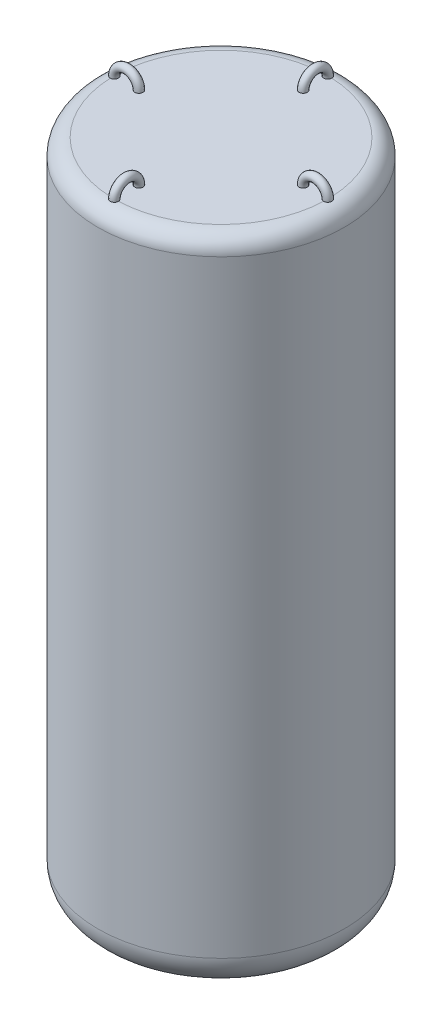
ISO-10303-21;
HEADER;
FILE_DESCRIPTION(('STEP AP214'),'2;1');
FILE_NAME('part.step','',(''),(''),'','','');
FILE_SCHEMA(('AUTOMOTIVE_DESIGN { 1 0 10303 214 1 1 1 1 }'));
ENDSEC;
DATA;
#1=APPLICATION_CONTEXT('core data for automotive mechanical design processes');
#2=APPLICATION_PROTOCOL_DEFINITION('international standard','automotive_design',2000,#1);
#3=PRODUCT_CONTEXT('',#1,'mechanical');
#4=PRODUCT('Part','Part','',(#3));
#5=PRODUCT_RELATED_PRODUCT_CATEGORY('part','',(#4));
#6=PRODUCT_DEFINITION_FORMATION('','',#4);
#7=PRODUCT_DEFINITION_CONTEXT('part definition',#1,'design');
#8=PRODUCT_DEFINITION('design','',#6,#7);
#9=PRODUCT_DEFINITION_SHAPE('','',#8);
#10=(LENGTH_UNIT() NAMED_UNIT(*) SI_UNIT(.MILLI.,.METRE.));
#11=(NAMED_UNIT(*) PLANE_ANGLE_UNIT() SI_UNIT($,.RADIAN.));
#12=(NAMED_UNIT(*) SI_UNIT($,.STERADIAN.) SOLID_ANGLE_UNIT());
#13=UNCERTAINTY_MEASURE_WITH_UNIT(LENGTH_MEASURE(1.E-05),#10,'distance_accuracy_value','');
#14=(GEOMETRIC_REPRESENTATION_CONTEXT(3) GLOBAL_UNCERTAINTY_ASSIGNED_CONTEXT((#13)) GLOBAL_UNIT_ASSIGNED_CONTEXT((#10,
#11,#12)) REPRESENTATION_CONTEXT('',''));
#15=CARTESIAN_POINT('',(0.,0.,0.));
#16=DIRECTION('',(0.,0.,1.));
#17=DIRECTION('',(1.,0.,0.));
#18=AXIS2_PLACEMENT_3D('',#15,#16,#17);
#19=CARTESIAN_POINT('',(0.,0.,0.));
#20=DIRECTION('',(0.,1.,0.));
#21=DIRECTION('',(0.,0.,1.));
#22=AXIS2_PLACEMENT_3D('',#19,#20,#21);
#23=PLANE('',#22);
#24=CARTESIAN_POINT('',(-5.76443569043001E-13,0.,-165.1));
#25=DIRECTION('',(0.,1.,0.));
#26=DIRECTION('',(0.,0.,1.));
#27=AXIS2_PLACEMENT_3D('',#24,#25,#26);
#28=CIRCLE('',#27,6.35);
#29=CARTESIAN_POINT('',(-6.34882570502983,0.,-164.977884615385));
#30=VERTEX_POINT('',#29);
#31=CARTESIAN_POINT('',(6.34882570502868,0.,-164.977884615385));
#32=VERTEX_POINT('',#31);
#33=EDGE_CURVE('E56',#30,#32,#28,.T.);
#34=ORIENTED_EDGE('',*,*,#33,.F.);
#35=CARTESIAN_POINT('',(0.,0.,0.));
#36=DIRECTION('',(0.,1.,0.));
#37=DIRECTION('',(0.,0.,1.));
#38=AXIS2_PLACEMENT_3D('',#35,#36,#37);
#39=CIRCLE('',#38,165.1);
#40=CARTESIAN_POINT('',(-164.977884615385,0.,-6.34882570502925));
#41=VERTEX_POINT('',#40);
#42=EDGE_CURVE('E94',#30,#41,#39,.T.);
#43=ORIENTED_EDGE('',*,*,#42,.T.);
#44=CARTESIAN_POINT('',(-165.1,0.,0.));
#45=DIRECTION('',(0.,1.,0.));
#46=DIRECTION('',(0.,0.,1.));
#47=AXIS2_PLACEMENT_3D('',#44,#45,#46);
#48=CIRCLE('',#47,6.35);
#49=CARTESIAN_POINT('',(-164.977884615385,0.,6.34882570502925));
#50=VERTEX_POINT('',#49);
#51=EDGE_CURVE('E124',#50,#41,#48,.T.);
#52=ORIENTED_EDGE('',*,*,#51,.F.);
#53=CARTESIAN_POINT('',(-6.3488257050277,0.,164.977884615385));
#54=VERTEX_POINT('',#53);
#55=EDGE_CURVE('E140',#50,#54,#39,.T.);
#56=ORIENTED_EDGE('',*,*,#55,.T.);
#57=CARTESIAN_POINT('',(1.72933070712891E-12,0.,165.099999999991));
#58=DIRECTION('',(0.,1.,0.));
#59=DIRECTION('',(0.,0.,1.));
#60=AXIS2_PLACEMENT_3D('',#57,#58,#59);
#61=CIRCLE('',#60,6.35);
#62=CARTESIAN_POINT('',(6.34882570503116,0.,164.977884615385));
#63=VERTEX_POINT('',#62);
#64=EDGE_CURVE('E63',#63,#54,#61,.T.);
#65=ORIENTED_EDGE('',*,*,#64,.F.);
#66=CARTESIAN_POINT('',(164.977884615366,0.,6.34882570502889));
#67=VERTEX_POINT('',#66);
#68=EDGE_CURVE('E99',#63,#67,#39,.T.);
#69=ORIENTED_EDGE('',*,*,#68,.T.);
#70=CARTESIAN_POINT('',(165.1,0.,0.));
#71=DIRECTION('',(0.,1.,0.));
#72=DIRECTION('',(0.,0.,1.));
#73=AXIS2_PLACEMENT_3D('',#70,#71,#72);
#74=CIRCLE('',#73,6.35);
#75=CARTESIAN_POINT('',(164.977884615385,0.,-6.34882570502961));
#76=VERTEX_POINT('',#75);
#77=EDGE_CURVE('E83',#76,#67,#74,.T.);
#78=ORIENTED_EDGE('',*,*,#77,.F.);
#79=EDGE_CURVE('E79',#76,#32,#39,.T.);
#80=ORIENTED_EDGE('',*,*,#79,.T.);
#81=EDGE_LOOP('',(#34,#43,#52,#56,#65,#69,#78,#80));
#82=FACE_BOUND('',#81,.T.);
#83=CARTESIAN_POINT('',(-5.76443569043001E-13,0.,-127.));
#84=DIRECTION('',(0.,1.,0.));
#85=DIRECTION('',(0.,0.,1.));
#86=AXIS2_PLACEMENT_3D('',#83,#84,#85);
#87=CIRCLE('',#86,6.35);
#88=CARTESIAN_POINT('',(-5.76443569043001E-13,0.,-120.65));
#89=VERTEX_POINT('',#88);
#90=EDGE_CURVE('E11',#89,#89,#87,.T.);
#91=ORIENTED_EDGE('',*,*,#90,.F.);
#92=EDGE_LOOP('',(#91));
#93=FACE_BOUND('',#92,.T.);
#94=CARTESIAN_POINT('',(-127.,0.,0.));
#95=DIRECTION('',(0.,-1.,0.));
#96=DIRECTION('',(0.,0.,1.));
#97=AXIS2_PLACEMENT_3D('',#94,#95,#96);
#98=CIRCLE('',#97,6.35);
#99=CARTESIAN_POINT('',(-127.,0.,6.35));
#100=VERTEX_POINT('',#99);
#101=EDGE_CURVE('E119',#100,#100,#98,.T.);
#102=ORIENTED_EDGE('',*,*,#101,.T.);
#103=EDGE_LOOP('',(#102));
#104=FACE_BOUND('',#103,.T.);
#105=CARTESIAN_POINT('',(127.,0.,0.));
#106=DIRECTION('',(0.,1.,0.));
#107=DIRECTION('',(0.,0.,1.));
#108=AXIS2_PLACEMENT_3D('',#105,#106,#107);
#109=CIRCLE('',#108,6.35);
#110=CARTESIAN_POINT('',(127.,0.,6.35));
#111=VERTEX_POINT('',#110);
#112=EDGE_CURVE('E49',#111,#111,#109,.T.);
#113=ORIENTED_EDGE('',*,*,#112,.F.);
#114=EDGE_LOOP('',(#113));
#115=FACE_BOUND('',#114,.T.);
#116=CARTESIAN_POINT('',(1.72933070712891E-12,0.,127.000000000009));
#117=DIRECTION('',(0.,-1.,0.));
#118=DIRECTION('',(0.,0.,-1.));
#119=AXIS2_PLACEMENT_3D('',#116,#117,#118);
#120=CIRCLE('',#119,6.35);
#121=CARTESIAN_POINT('',(1.72933070712891E-12,0.,120.650000000009));
#122=VERTEX_POINT('',#121);
#123=EDGE_CURVE('E107',#122,#122,#120,.T.);
#124=ORIENTED_EDGE('',*,*,#123,.T.);
#125=EDGE_LOOP('',(#124));
#126=FACE_BOUND('',#125,.T.);
#127=ADVANCED_FACE('F40',(#82,#93,#104,#115,#126),#23,.T.);
#128=CARTESIAN_POINT('',(0.,-1016.,0.));
#129=DIRECTION('',(0.,1.,0.));
#130=DIRECTION('',(0.,0.,1.));
#131=AXIS2_PLACEMENT_3D('',#128,#129,#130);
#132=CYLINDRICAL_SURFACE('',#131,190.5);
#133=CARTESIAN_POINT('',(0.,-25.4,0.));
#134=DIRECTION('',(0.,1.,0.));
#135=DIRECTION('',(0.,0.,1.));
#136=AXIS2_PLACEMENT_3D('',#133,#134,#135);
#137=CIRCLE('',#136,190.5);
#138=CARTESIAN_POINT('',(0.,-25.4,190.5));
#139=VERTEX_POINT('',#138);
#140=EDGE_CURVE('E139',#139,#139,#137,.F.);
#141=ORIENTED_EDGE('',*,*,#140,.T.);
#142=EDGE_LOOP('',(#141));
#143=FACE_BOUND('',#142,.T.);
#144=CARTESIAN_POINT('',(0.,-965.2,0.));
#145=DIRECTION('',(0.,1.,0.));
#146=DIRECTION('',(0.,0.,1.));
#147=AXIS2_PLACEMENT_3D('',#144,#145,#146);
#148=CIRCLE('',#147,190.5);
#149=CARTESIAN_POINT('',(0.,-965.2,190.5));
#150=VERTEX_POINT('',#149);
#151=EDGE_CURVE('E128',#150,#150,#148,.T.);
#152=ORIENTED_EDGE('',*,*,#151,.T.);
#153=EDGE_LOOP('',(#152));
#154=FACE_BOUND('',#153,.T.);
#155=ADVANCED_FACE('F153',(#143,#154),#132,.T.);
#156=CARTESIAN_POINT('',(0.,-1016.,0.));
#157=DIRECTION('',(0.,1.,0.));
#158=DIRECTION('',(0.,0.,1.));
#159=AXIS2_PLACEMENT_3D('',#156,#157,#158);
#160=PLANE('',#159);
#161=CARTESIAN_POINT('',(0.,-1016.,0.));
#162=DIRECTION('',(0.,1.,0.));
#163=DIRECTION('',(0.,0.,1.));
#164=AXIS2_PLACEMENT_3D('',#161,#162,#163);
#165=CIRCLE('',#164,139.7);
#166=CARTESIAN_POINT('',(0.,-1016.,139.7));
#167=VERTEX_POINT('',#166);
#168=EDGE_CURVE('E132',#167,#167,#165,.F.);
#169=ORIENTED_EDGE('',*,*,#168,.T.);
#170=EDGE_LOOP('',(#169));
#171=FACE_BOUND('',#170,.T.);
#172=ADVANCED_FACE('F185',(#171),#160,.F.);
#173=CARTESIAN_POINT('',(0.,-965.2,0.));
#174=DIRECTION('',(0.,1.,0.));
#175=DIRECTION('',(0.,0.,1.));
#176=AXIS2_PLACEMENT_3D('',#173,#174,#175);
#177=TOROIDAL_SURFACE('',#176,139.7,50.8);
#178=ORIENTED_EDGE('',*,*,#168,.F.);
#179=EDGE_LOOP('',(#178));
#180=FACE_BOUND('',#179,.T.);
#181=ORIENTED_EDGE('',*,*,#151,.F.);
#182=EDGE_LOOP('',(#181));
#183=FACE_BOUND('',#182,.T.);
#184=ADVANCED_FACE('F187',(#180,#183),#177,.T.);
#185=CARTESIAN_POINT('',(0.,-25.4,0.));
#186=DIRECTION('',(0.,1.,0.));
#187=DIRECTION('',(0.,0.,1.));
#188=AXIS2_PLACEMENT_3D('',#185,#186,#187);
#189=TOROIDAL_SURFACE('',#188,165.1,25.4);
#190=ORIENTED_EDGE('',*,*,#140,.F.);
#191=EDGE_LOOP('',(#190));
#192=FACE_BOUND('',#191,.T.);
#193=EDGE_CURVE('E135',#41,#50,#39,.T.);
#194=ORIENTED_EDGE('',*,*,#193,.F.);
#195=ORIENTED_EDGE('',*,*,#42,.F.);
#196=EDGE_CURVE('E89',#32,#30,#39,.T.);
#197=ORIENTED_EDGE('',*,*,#196,.F.);
#198=ORIENTED_EDGE('',*,*,#79,.F.);
#199=EDGE_CURVE('E88',#67,#76,#39,.T.);
#200=ORIENTED_EDGE('',*,*,#199,.F.);
#201=ORIENTED_EDGE('',*,*,#68,.F.);
#202=EDGE_CURVE('E91',#54,#63,#39,.T.);
#203=ORIENTED_EDGE('',*,*,#202,.F.);
#204=ORIENTED_EDGE('',*,*,#55,.F.);
#205=EDGE_LOOP('',(#194,#195,#197,#198,#200,#201,#203,#204));
#206=FACE_BOUND('',#205,.T.);
#207=ADVANCED_FACE('F42',(#192,#206),#189,.T.);
#208=CARTESIAN_POINT('',(-165.1,0.,0.));
#209=DIRECTION('',(0.,1.,0.));
#210=DIRECTION('',(0.,0.,1.));
#211=AXIS2_PLACEMENT_3D('',#208,#209,#210);
#212=PLANE('',#211);
#213=EDGE_CURVE('E123',#41,#50,#48,.T.);
#214=ORIENTED_EDGE('',*,*,#213,.F.);
#215=ORIENTED_EDGE('',*,*,#193,.T.);
#216=EDGE_LOOP('',(#214,#215));
#217=FACE_BOUND('',#216,.T.);
#218=ADVANCED_FACE('F180',(#217),#212,.F.);
#219=CARTESIAN_POINT('',(-146.05,0.,0.));
#220=DIRECTION('',(0.,0.,1.));
#221=DIRECTION('',(1.,0.,0.));
#222=AXIS2_PLACEMENT_3D('',#219,#220,#221);
#223=TOROIDAL_SURFACE('',#222,19.05,6.35);
#224=ORIENTED_EDGE('',*,*,#51,.T.);
#225=ORIENTED_EDGE('',*,*,#213,.T.);
#226=EDGE_LOOP('',(#224,#225));
#227=FACE_BOUND('',#226,.T.);
#228=ORIENTED_EDGE('',*,*,#101,.F.);
#229=EDGE_LOOP('',(#228));
#230=FACE_BOUND('',#229,.T.);
#231=ADVANCED_FACE('F176',(#227,#230),#223,.T.);
#232=CARTESIAN_POINT('',(165.1,0.,0.));
#233=DIRECTION('',(0.,1.,0.));
#234=DIRECTION('',(0.,0.,1.));
#235=AXIS2_PLACEMENT_3D('',#232,#233,#234);
#236=PLANE('',#235);
#237=EDGE_CURVE('E116',#67,#76,#74,.T.);
#238=ORIENTED_EDGE('',*,*,#237,.F.);
#239=ORIENTED_EDGE('',*,*,#199,.T.);
#240=EDGE_LOOP('',(#238,#239));
#241=FACE_BOUND('',#240,.T.);
#242=ADVANCED_FACE('F173',(#241),#236,.F.);
#243=CARTESIAN_POINT('',(146.05,0.,0.));
#244=DIRECTION('',(0.,0.,1.));
#245=DIRECTION('',(1.,0.,0.));
#246=AXIS2_PLACEMENT_3D('',#243,#244,#245);
#247=TOROIDAL_SURFACE('',#246,19.05,6.35);
#248=ORIENTED_EDGE('',*,*,#112,.T.);
#249=EDGE_LOOP('',(#248));
#250=FACE_BOUND('',#249,.T.);
#251=ORIENTED_EDGE('',*,*,#77,.T.);
#252=ORIENTED_EDGE('',*,*,#237,.T.);
#253=EDGE_LOOP('',(#251,#252));
#254=FACE_BOUND('',#253,.T.);
#255=ADVANCED_FACE('F148',(#250,#254),#247,.T.);
#256=CARTESIAN_POINT('',(1.72933070712891E-12,0.,165.099999999991));
#257=DIRECTION('',(0.,1.,0.));
#258=DIRECTION('',(0.,0.,1.));
#259=AXIS2_PLACEMENT_3D('',#256,#257,#258);
#260=PLANE('',#259);
#261=EDGE_CURVE('E111',#54,#63,#61,.T.);
#262=ORIENTED_EDGE('',*,*,#261,.F.);
#263=ORIENTED_EDGE('',*,*,#202,.T.);
#264=EDGE_LOOP('',(#262,#263));
#265=FACE_BOUND('',#264,.T.);
#266=ADVANCED_FACE('F159',(#265),#260,.F.);
#267=CARTESIAN_POINT('',(1.72933070712891E-12,0.,146.05));
#268=DIRECTION('',(1.,0.,0.));
#269=DIRECTION('',(0.,0.,-1.));
#270=AXIS2_PLACEMENT_3D('',#267,#268,#269);
#271=TOROIDAL_SURFACE('',#270,19.0499999999907,6.35);
#272=ORIENTED_EDGE('',*,*,#64,.T.);
#273=ORIENTED_EDGE('',*,*,#261,.T.);
#274=EDGE_LOOP('',(#272,#273));
#275=FACE_BOUND('',#274,.T.);
#276=ORIENTED_EDGE('',*,*,#123,.F.);
#277=EDGE_LOOP('',(#276));
#278=FACE_BOUND('',#277,.T.);
#279=ADVANCED_FACE('F157',(#275,#278),#271,.T.);
#280=CARTESIAN_POINT('',(-5.76443569043001E-13,0.,-165.1));
#281=DIRECTION('',(0.,1.,0.));
#282=DIRECTION('',(0.,0.,1.));
#283=AXIS2_PLACEMENT_3D('',#280,#281,#282);
#284=PLANE('',#283);
#285=EDGE_CURVE('E102',#32,#30,#28,.T.);
#286=ORIENTED_EDGE('',*,*,#285,.F.);
#287=ORIENTED_EDGE('',*,*,#196,.T.);
#288=EDGE_LOOP('',(#286,#287));
#289=FACE_BOUND('',#288,.T.);
#290=ADVANCED_FACE('F105',(#289),#284,.F.);
#291=CARTESIAN_POINT('',(-5.76443569043001E-13,0.,-146.05));
#292=DIRECTION('',(1.,0.,0.));
#293=DIRECTION('',(0.,0.,-1.));
#294=AXIS2_PLACEMENT_3D('',#291,#292,#293);
#295=TOROIDAL_SURFACE('',#294,19.05,6.35);
#296=ORIENTED_EDGE('',*,*,#90,.T.);
#297=EDGE_LOOP('',(#296));
#298=FACE_BOUND('',#297,.T.);
#299=ORIENTED_EDGE('',*,*,#285,.T.);
#300=ORIENTED_EDGE('',*,*,#33,.T.);
#301=EDGE_LOOP('',(#299,#300));
#302=FACE_BOUND('',#301,.T.);
#303=ADVANCED_FACE('F101',(#298,#302),#295,.T.);
#304=CLOSED_SHELL('',(#127,#155,#172,#184,#207,#218,#231,#242,#255,#266,#279,#290,#303));
#305=MANIFOLD_SOLID_BREP('B2',#304);
#306=ADVANCED_BREP_SHAPE_REPRESENTATION('',(#18,#305),#14);
#307=SHAPE_DEFINITION_REPRESENTATION(#9,#306);
ENDSEC;
END-ISO-10303-21;
